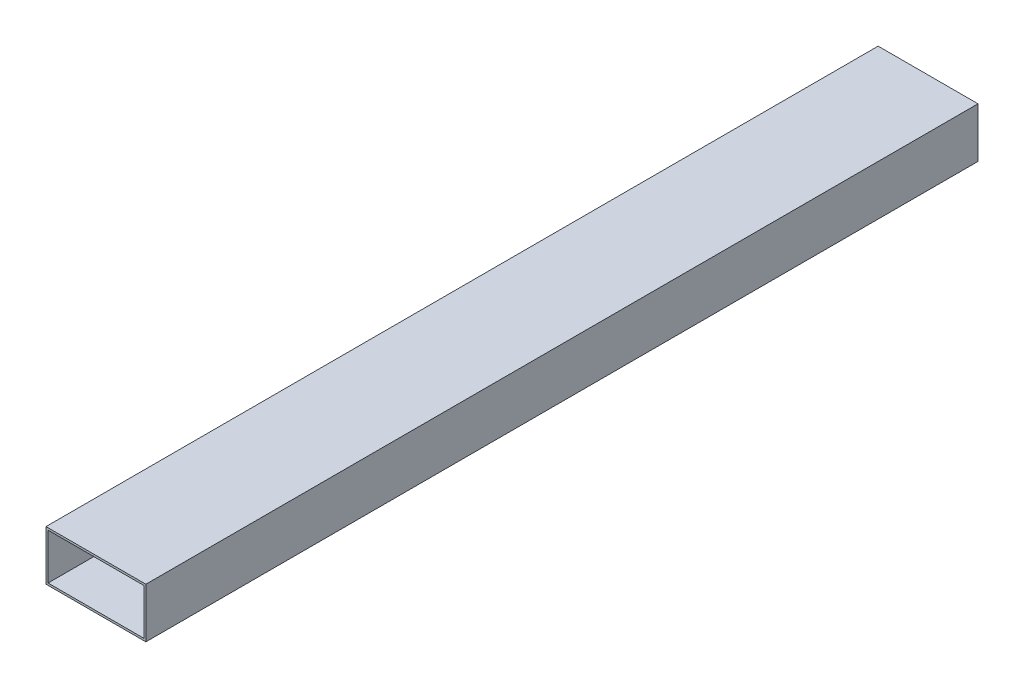
ISO-10303-21;
HEADER;
FILE_DESCRIPTION(('STEP AP214'),'2;1');
FILE_NAME('part.step','',(''),(''),'','','');
FILE_SCHEMA(('AUTOMOTIVE_DESIGN { 1 0 10303 214 1 1 1 1 }'));
ENDSEC;
DATA;
#1=APPLICATION_CONTEXT('core data for automotive mechanical design processes');
#2=APPLICATION_PROTOCOL_DEFINITION('international standard','automotive_design',2000,#1);
#3=PRODUCT_CONTEXT('',#1,'mechanical');
#4=PRODUCT('Part','Part','',(#3));
#5=PRODUCT_RELATED_PRODUCT_CATEGORY('part','',(#4));
#6=PRODUCT_DEFINITION_FORMATION('','',#4);
#7=PRODUCT_DEFINITION_CONTEXT('part definition',#1,'design');
#8=PRODUCT_DEFINITION('design','',#6,#7);
#9=PRODUCT_DEFINITION_SHAPE('','',#8);
#10=(LENGTH_UNIT() NAMED_UNIT(*) SI_UNIT(.MILLI.,.METRE.));
#11=(NAMED_UNIT(*) PLANE_ANGLE_UNIT() SI_UNIT($,.RADIAN.));
#12=(NAMED_UNIT(*) SI_UNIT($,.STERADIAN.) SOLID_ANGLE_UNIT());
#13=UNCERTAINTY_MEASURE_WITH_UNIT(LENGTH_MEASURE(1.E-05),#10,'distance_accuracy_value','');
#14=(GEOMETRIC_REPRESENTATION_CONTEXT(3) GLOBAL_UNCERTAINTY_ASSIGNED_CONTEXT((#13)) GLOBAL_UNIT_ASSIGNED_CONTEXT((#10,
#11,#12)) REPRESENTATION_CONTEXT('',''));
#15=CARTESIAN_POINT('',(0.,0.,0.));
#16=DIRECTION('',(0.,0.,1.));
#17=DIRECTION('',(1.,0.,0.));
#18=AXIS2_PLACEMENT_3D('',#15,#16,#17);
#19=CARTESIAN_POINT('',(0.,0.,400.));
#20=DIRECTION('',(0.,0.,-1.));
#21=DIRECTION('',(-1.,0.,0.));
#22=AXIS2_PLACEMENT_3D('',#19,#20,#21);
#23=PLANE('',#22);
#24=DIRECTION('',(0.,1.,0.));
#25=VECTOR('',#24,1.);
#26=CARTESIAN_POINT('',(24.,-12.,400.));
#27=LINE('',#26,#25);
#28=CARTESIAN_POINT('',(24.,-12.,400.));
#29=VERTEX_POINT('',#28);
#30=CARTESIAN_POINT('',(24.,12.,400.));
#31=VERTEX_POINT('',#30);
#32=EDGE_CURVE('E153',#29,#31,#27,.T.);
#33=ORIENTED_EDGE('',*,*,#32,.T.);
#34=DIRECTION('',(-1.,0.,0.));
#35=VECTOR('',#34,1.);
#36=CARTESIAN_POINT('',(-24.,12.,400.));
#37=LINE('',#36,#35);
#38=CARTESIAN_POINT('',(-24.,12.,400.));
#39=VERTEX_POINT('',#38);
#40=EDGE_CURVE('E157',#31,#39,#37,.T.);
#41=ORIENTED_EDGE('',*,*,#40,.T.);
#42=DIRECTION('',(0.,-1.,0.));
#43=VECTOR('',#42,1.);
#44=CARTESIAN_POINT('',(-24.,-12.,400.));
#45=LINE('',#44,#43);
#46=CARTESIAN_POINT('',(-24.,-12.,400.));
#47=VERTEX_POINT('',#46);
#48=EDGE_CURVE('E161',#39,#47,#45,.T.);
#49=ORIENTED_EDGE('',*,*,#48,.T.);
#50=DIRECTION('',(1.,0.,0.));
#51=VECTOR('',#50,1.);
#52=CARTESIAN_POINT('',(-24.,-12.,400.));
#53=LINE('',#52,#51);
#54=EDGE_CURVE('E164',#47,#29,#53,.T.);
#55=ORIENTED_EDGE('',*,*,#54,.T.);
#56=EDGE_LOOP('',(#33,#41,#49,#55));
#57=FACE_BOUND('',#56,.T.);
#58=DIRECTION('',(0.,-1.,0.));
#59=VECTOR('',#58,1.);
#60=CARTESIAN_POINT('',(-23.,-11.,400.));
#61=LINE('',#60,#59);
#62=CARTESIAN_POINT('',(-23.,11.,400.));
#63=VERTEX_POINT('',#62);
#64=CARTESIAN_POINT('',(-23.,-11.,400.));
#65=VERTEX_POINT('',#64);
#66=EDGE_CURVE('E105',#63,#65,#61,.T.);
#67=ORIENTED_EDGE('',*,*,#66,.F.);
#68=DIRECTION('',(-1.,0.,0.));
#69=VECTOR('',#68,1.);
#70=CARTESIAN_POINT('',(-23.,11.,400.));
#71=LINE('',#70,#69);
#72=CARTESIAN_POINT('',(23.,11.,400.));
#73=VERTEX_POINT('',#72);
#74=EDGE_CURVE('E131',#73,#63,#71,.T.);
#75=ORIENTED_EDGE('',*,*,#74,.F.);
#76=DIRECTION('',(0.,1.,0.));
#77=VECTOR('',#76,1.);
#78=CARTESIAN_POINT('',(23.,-11.,400.));
#79=LINE('',#78,#77);
#80=CARTESIAN_POINT('',(23.,-11.,400.));
#81=VERTEX_POINT('',#80);
#82=EDGE_CURVE('E127',#81,#73,#79,.T.);
#83=ORIENTED_EDGE('',*,*,#82,.F.);
#84=DIRECTION('',(1.,0.,0.));
#85=VECTOR('',#84,1.);
#86=CARTESIAN_POINT('',(-23.,-11.,400.));
#87=LINE('',#86,#85);
#88=EDGE_CURVE('E114',#65,#81,#87,.T.);
#89=ORIENTED_EDGE('',*,*,#88,.F.);
#90=EDGE_LOOP('',(#67,#75,#83,#89));
#91=FACE_BOUND('',#90,.T.);
#92=ADVANCED_FACE('F39',(#57,#91),#23,.F.);
#93=CARTESIAN_POINT('',(0.,0.,0.));
#94=DIRECTION('',(0.,0.,-1.));
#95=DIRECTION('',(-1.,0.,0.));
#96=AXIS2_PLACEMENT_3D('',#93,#94,#95);
#97=PLANE('',#96);
#98=DIRECTION('',(0.,1.,0.));
#99=VECTOR('',#98,1.);
#100=CARTESIAN_POINT('',(24.,-12.,0.));
#101=LINE('',#100,#99);
#102=CARTESIAN_POINT('',(24.,-12.,0.));
#103=VERTEX_POINT('',#102);
#104=CARTESIAN_POINT('',(24.,12.,0.));
#105=VERTEX_POINT('',#104);
#106=EDGE_CURVE('E123',#103,#105,#101,.T.);
#107=ORIENTED_EDGE('',*,*,#106,.F.);
#108=DIRECTION('',(1.,0.,0.));
#109=VECTOR('',#108,1.);
#110=CARTESIAN_POINT('',(-24.,-12.,0.));
#111=LINE('',#110,#109);
#112=CARTESIAN_POINT('',(-24.,-12.,0.));
#113=VERTEX_POINT('',#112);
#114=EDGE_CURVE('E158',#113,#103,#111,.T.);
#115=ORIENTED_EDGE('',*,*,#114,.F.);
#116=DIRECTION('',(0.,-1.,0.));
#117=VECTOR('',#116,1.);
#118=CARTESIAN_POINT('',(-24.,-12.,0.));
#119=LINE('',#118,#117);
#120=CARTESIAN_POINT('',(-24.,12.,0.));
#121=VERTEX_POINT('',#120);
#122=EDGE_CURVE('E174',#121,#113,#119,.T.);
#123=ORIENTED_EDGE('',*,*,#122,.F.);
#124=DIRECTION('',(-1.,0.,0.));
#125=VECTOR('',#124,1.);
#126=CARTESIAN_POINT('',(-24.,12.,0.));
#127=LINE('',#126,#125);
#128=EDGE_CURVE('E171',#105,#121,#127,.T.);
#129=ORIENTED_EDGE('',*,*,#128,.F.);
#130=EDGE_LOOP('',(#107,#115,#123,#129));
#131=FACE_BOUND('',#130,.T.);
#132=DIRECTION('',(-1.,0.,0.));
#133=VECTOR('',#132,1.);
#134=CARTESIAN_POINT('',(-23.,11.,0.));
#135=LINE('',#134,#133);
#136=CARTESIAN_POINT('',(23.,11.,0.));
#137=VERTEX_POINT('',#136);
#138=CARTESIAN_POINT('',(-23.,11.,0.));
#139=VERTEX_POINT('',#138);
#140=EDGE_CURVE('E115',#137,#139,#135,.T.);
#141=ORIENTED_EDGE('',*,*,#140,.T.);
#142=DIRECTION('',(0.,-1.,0.));
#143=VECTOR('',#142,1.);
#144=CARTESIAN_POINT('',(-23.,-11.,0.));
#145=LINE('',#144,#143);
#146=CARTESIAN_POINT('',(-23.,-11.,0.));
#147=VERTEX_POINT('',#146);
#148=EDGE_CURVE('E63',#139,#147,#145,.T.);
#149=ORIENTED_EDGE('',*,*,#148,.T.);
#150=DIRECTION('',(1.,0.,0.));
#151=VECTOR('',#150,1.);
#152=CARTESIAN_POINT('',(-23.,-11.,0.));
#153=LINE('',#152,#151);
#154=CARTESIAN_POINT('',(23.,-11.,0.));
#155=VERTEX_POINT('',#154);
#156=EDGE_CURVE('E121',#147,#155,#153,.T.);
#157=ORIENTED_EDGE('',*,*,#156,.T.);
#158=DIRECTION('',(0.,1.,0.));
#159=VECTOR('',#158,1.);
#160=CARTESIAN_POINT('',(23.,-11.,0.));
#161=LINE('',#160,#159);
#162=EDGE_CURVE('E140',#155,#137,#161,.T.);
#163=ORIENTED_EDGE('',*,*,#162,.T.);
#164=EDGE_LOOP('',(#141,#149,#157,#163));
#165=FACE_BOUND('',#164,.T.);
#166=ADVANCED_FACE('F197',(#131,#165),#97,.T.);
#167=CARTESIAN_POINT('',(24.,-12.,400.));
#168=DIRECTION('',(-1.,0.,0.));
#169=DIRECTION('',(0.,0.,1.));
#170=AXIS2_PLACEMENT_3D('',#167,#168,#169);
#171=PLANE('',#170);
#172=ORIENTED_EDGE('',*,*,#106,.T.);
#173=DIRECTION('',(0.,0.,-1.));
#174=VECTOR('',#173,1.);
#175=CARTESIAN_POINT('',(24.,12.,400.));
#176=LINE('',#175,#174);
#177=EDGE_CURVE('E11',#31,#105,#176,.T.);
#178=ORIENTED_EDGE('',*,*,#177,.F.);
#179=ORIENTED_EDGE('',*,*,#32,.F.);
#180=DIRECTION('',(0.,0.,-1.));
#181=VECTOR('',#180,1.);
#182=CARTESIAN_POINT('',(24.,-12.,400.));
#183=LINE('',#182,#181);
#184=EDGE_CURVE('E167',#29,#103,#183,.T.);
#185=ORIENTED_EDGE('',*,*,#184,.T.);
#186=EDGE_LOOP('',(#172,#178,#179,#185));
#187=FACE_BOUND('',#186,.T.);
#188=ADVANCED_FACE('F41',(#187),#171,.F.);
#189=CARTESIAN_POINT('',(-24.,12.,400.));
#190=DIRECTION('',(0.,-1.,0.));
#191=DIRECTION('',(0.,0.,-1.));
#192=AXIS2_PLACEMENT_3D('',#189,#190,#191);
#193=PLANE('',#192);
#194=ORIENTED_EDGE('',*,*,#128,.T.);
#195=DIRECTION('',(0.,0.,-1.));
#196=VECTOR('',#195,1.);
#197=CARTESIAN_POINT('',(-24.,12.,400.));
#198=LINE('',#197,#196);
#199=EDGE_CURVE('E48',#39,#121,#198,.T.);
#200=ORIENTED_EDGE('',*,*,#199,.F.);
#201=ORIENTED_EDGE('',*,*,#40,.F.);
#202=ORIENTED_EDGE('',*,*,#177,.T.);
#203=EDGE_LOOP('',(#194,#200,#201,#202));
#204=FACE_BOUND('',#203,.T.);
#205=ADVANCED_FACE('F207',(#204),#193,.F.);
#206=CARTESIAN_POINT('',(-24.,-12.,400.));
#207=DIRECTION('',(1.,0.,0.));
#208=DIRECTION('',(0.,0.,-1.));
#209=AXIS2_PLACEMENT_3D('',#206,#207,#208);
#210=PLANE('',#209);
#211=ORIENTED_EDGE('',*,*,#122,.T.);
#212=DIRECTION('',(0.,0.,-1.));
#213=VECTOR('',#212,1.);
#214=CARTESIAN_POINT('',(-24.,-12.,400.));
#215=LINE('',#214,#213);
#216=EDGE_CURVE('E182',#47,#113,#215,.T.);
#217=ORIENTED_EDGE('',*,*,#216,.F.);
#218=ORIENTED_EDGE('',*,*,#48,.F.);
#219=ORIENTED_EDGE('',*,*,#199,.T.);
#220=EDGE_LOOP('',(#211,#217,#218,#219));
#221=FACE_BOUND('',#220,.T.);
#222=ADVANCED_FACE('F191',(#221),#210,.F.);
#223=CARTESIAN_POINT('',(-24.,-12.,400.));
#224=DIRECTION('',(0.,1.,0.));
#225=DIRECTION('',(0.,0.,1.));
#226=AXIS2_PLACEMENT_3D('',#223,#224,#225);
#227=PLANE('',#226);
#228=ORIENTED_EDGE('',*,*,#114,.T.);
#229=ORIENTED_EDGE('',*,*,#184,.F.);
#230=ORIENTED_EDGE('',*,*,#54,.F.);
#231=ORIENTED_EDGE('',*,*,#216,.T.);
#232=EDGE_LOOP('',(#228,#229,#230,#231));
#233=FACE_BOUND('',#232,.T.);
#234=ADVANCED_FACE('F201',(#233),#227,.F.);
#235=CARTESIAN_POINT('',(-23.,-11.,400.));
#236=DIRECTION('',(1.,0.,0.));
#237=DIRECTION('',(0.,0.,-1.));
#238=AXIS2_PLACEMENT_3D('',#235,#236,#237);
#239=PLANE('',#238);
#240=ORIENTED_EDGE('',*,*,#148,.F.);
#241=DIRECTION('',(0.,0.,-1.));
#242=VECTOR('',#241,1.);
#243=CARTESIAN_POINT('',(-23.,11.,400.));
#244=LINE('',#243,#242);
#245=EDGE_CURVE('E109',#63,#139,#244,.T.);
#246=ORIENTED_EDGE('',*,*,#245,.F.);
#247=ORIENTED_EDGE('',*,*,#66,.T.);
#248=DIRECTION('',(0.,0.,-1.));
#249=VECTOR('',#248,1.);
#250=CARTESIAN_POINT('',(-23.,-11.,400.));
#251=LINE('',#250,#249);
#252=EDGE_CURVE('E108',#65,#147,#251,.T.);
#253=ORIENTED_EDGE('',*,*,#252,.T.);
#254=EDGE_LOOP('',(#240,#246,#247,#253));
#255=FACE_BOUND('',#254,.T.);
#256=ADVANCED_FACE('F107',(#255),#239,.T.);
#257=CARTESIAN_POINT('',(-23.,-11.,400.));
#258=DIRECTION('',(0.,1.,0.));
#259=DIRECTION('',(-1.,0.,0.));
#260=AXIS2_PLACEMENT_3D('',#257,#258,#259);
#261=PLANE('',#260);
#262=ORIENTED_EDGE('',*,*,#156,.F.);
#263=ORIENTED_EDGE('',*,*,#252,.F.);
#264=ORIENTED_EDGE('',*,*,#88,.T.);
#265=DIRECTION('',(0.,0.,-1.));
#266=VECTOR('',#265,1.);
#267=CARTESIAN_POINT('',(23.,-11.,400.));
#268=LINE('',#267,#266);
#269=EDGE_CURVE('E124',#81,#155,#268,.T.);
#270=ORIENTED_EDGE('',*,*,#269,.T.);
#271=EDGE_LOOP('',(#262,#263,#264,#270));
#272=FACE_BOUND('',#271,.T.);
#273=ADVANCED_FACE('F118',(#272),#261,.T.);
#274=CARTESIAN_POINT('',(23.,-11.,400.));
#275=DIRECTION('',(-1.,0.,0.));
#276=DIRECTION('',(0.,0.,1.));
#277=AXIS2_PLACEMENT_3D('',#274,#275,#276);
#278=PLANE('',#277);
#279=ORIENTED_EDGE('',*,*,#162,.F.);
#280=ORIENTED_EDGE('',*,*,#269,.F.);
#281=ORIENTED_EDGE('',*,*,#82,.T.);
#282=DIRECTION('',(0.,0.,-1.));
#283=VECTOR('',#282,1.);
#284=CARTESIAN_POINT('',(23.,11.,400.));
#285=LINE('',#284,#283);
#286=EDGE_CURVE('E55',#73,#137,#285,.T.);
#287=ORIENTED_EDGE('',*,*,#286,.T.);
#288=EDGE_LOOP('',(#279,#280,#281,#287));
#289=FACE_BOUND('',#288,.T.);
#290=ADVANCED_FACE('F230',(#289),#278,.T.);
#291=CARTESIAN_POINT('',(-23.,11.,400.));
#292=DIRECTION('',(0.,-1.,0.));
#293=DIRECTION('',(0.,0.,-1.));
#294=AXIS2_PLACEMENT_3D('',#291,#292,#293);
#295=PLANE('',#294);
#296=ORIENTED_EDGE('',*,*,#140,.F.);
#297=ORIENTED_EDGE('',*,*,#286,.F.);
#298=ORIENTED_EDGE('',*,*,#74,.T.);
#299=ORIENTED_EDGE('',*,*,#245,.T.);
#300=EDGE_LOOP('',(#296,#297,#298,#299));
#301=FACE_BOUND('',#300,.T.);
#302=ADVANCED_FACE('F234',(#301),#295,.T.);
#303=CLOSED_SHELL('',(#92,#166,#188,#205,#222,#234,#256,#273,#290,#302));
#304=MANIFOLD_SOLID_BREP('B2',#303);
#305=ADVANCED_BREP_SHAPE_REPRESENTATION('',(#18,#304),#14);
#306=SHAPE_DEFINITION_REPRESENTATION(#9,#305);
ENDSEC;
END-ISO-10303-21;
